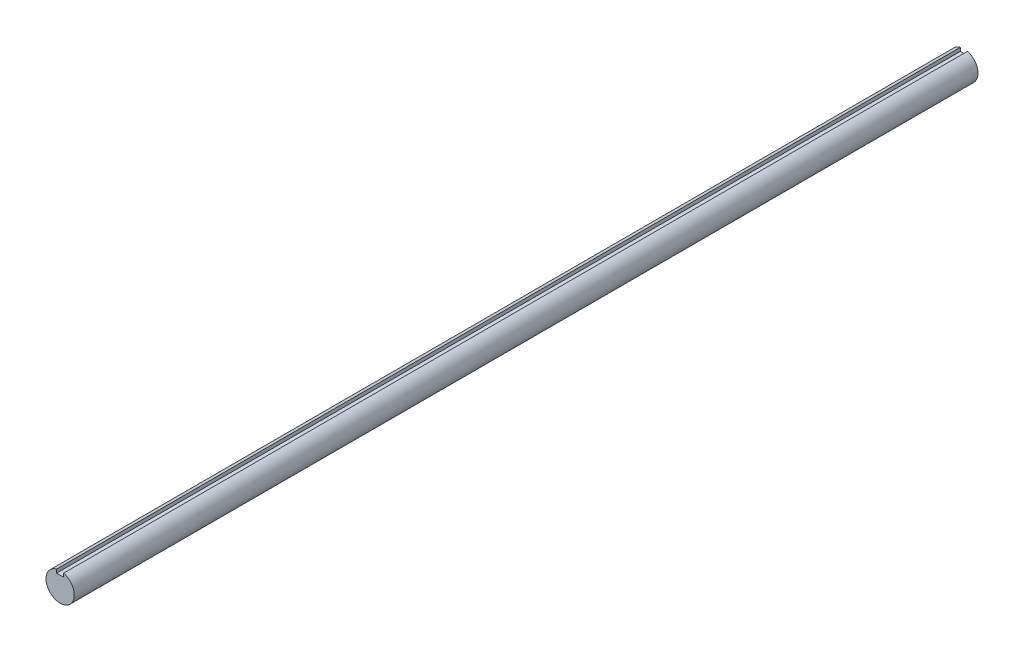
ISO-10303-21;
HEADER;
FILE_DESCRIPTION(('STEP AP214'),'2;1');
FILE_NAME('part.step','',(''),(''),'','','');
FILE_SCHEMA(('AUTOMOTIVE_DESIGN { 1 0 10303 214 1 1 1 1 }'));
ENDSEC;
DATA;
#1=APPLICATION_CONTEXT('core data for automotive mechanical design processes');
#2=APPLICATION_PROTOCOL_DEFINITION('international standard','automotive_design',2000,#1);
#3=PRODUCT_CONTEXT('',#1,'mechanical');
#4=PRODUCT('Part','Part','',(#3));
#5=PRODUCT_RELATED_PRODUCT_CATEGORY('part','',(#4));
#6=PRODUCT_DEFINITION_FORMATION('','',#4);
#7=PRODUCT_DEFINITION_CONTEXT('part definition',#1,'design');
#8=PRODUCT_DEFINITION('design','',#6,#7);
#9=PRODUCT_DEFINITION_SHAPE('','',#8);
#10=(LENGTH_UNIT() NAMED_UNIT(*) SI_UNIT(.MILLI.,.METRE.));
#11=(NAMED_UNIT(*) PLANE_ANGLE_UNIT() SI_UNIT($,.RADIAN.));
#12=(NAMED_UNIT(*) SI_UNIT($,.STERADIAN.) SOLID_ANGLE_UNIT());
#13=UNCERTAINTY_MEASURE_WITH_UNIT(LENGTH_MEASURE(1.E-05),#10,'distance_accuracy_value','');
#14=(GEOMETRIC_REPRESENTATION_CONTEXT(3) GLOBAL_UNCERTAINTY_ASSIGNED_CONTEXT((#13)) GLOBAL_UNIT_ASSIGNED_CONTEXT((#10,
#11,#12)) REPRESENTATION_CONTEXT('',''));
#15=CARTESIAN_POINT('',(0.,0.,0.));
#16=DIRECTION('',(0.,0.,1.));
#17=DIRECTION('',(1.,0.,0.));
#18=AXIS2_PLACEMENT_3D('',#15,#16,#17);
#19=CARTESIAN_POINT('',(0.,0.,304.8));
#20=DIRECTION('',(0.,0.,-1.));
#21=DIRECTION('',(-1.,0.,0.));
#22=AXIS2_PLACEMENT_3D('',#19,#20,#21);
#23=CYLINDRICAL_SURFACE('',#22,9.525);
#24=DIRECTION('',(0.,0.,-1.));
#25=VECTOR('',#24,1.);
#26=CARTESIAN_POINT('',(-2.3876,9.22089969796874,304.8));
#27=LINE('',#26,#25);
#28=CARTESIAN_POINT('',(-2.3876,9.22089969796874,304.8));
#29=VERTEX_POINT('',#28);
#30=CARTESIAN_POINT('',(-2.3876,9.22089969796874,-304.8));
#31=VERTEX_POINT('',#30);
#32=EDGE_CURVE('E91',#29,#31,#27,.T.);
#33=ORIENTED_EDGE('',*,*,#32,.T.);
#34=CARTESIAN_POINT('',(0.,0.,-304.8));
#35=DIRECTION('',(0.,0.,1.));
#36=DIRECTION('',(1.,0.,0.));
#37=AXIS2_PLACEMENT_3D('',#34,#35,#36);
#38=CIRCLE('',#37,9.525);
#39=CARTESIAN_POINT('',(2.3876,9.22089969796874,-304.8));
#40=VERTEX_POINT('',#39);
#41=EDGE_CURVE('E86',#31,#40,#38,.T.);
#42=ORIENTED_EDGE('',*,*,#41,.T.);
#43=DIRECTION('',(0.,0.,-1.));
#44=VECTOR('',#43,1.);
#45=CARTESIAN_POINT('',(2.3876,9.22089969796874,304.8));
#46=LINE('',#45,#44);
#47=CARTESIAN_POINT('',(2.3876,9.22089969796874,304.8));
#48=VERTEX_POINT('',#47);
#49=EDGE_CURVE('E11',#48,#40,#46,.T.);
#50=ORIENTED_EDGE('',*,*,#49,.F.);
#51=CARTESIAN_POINT('',(0.,0.,304.8));
#52=DIRECTION('',(0.,0.,1.));
#53=DIRECTION('',(1.,0.,0.));
#54=AXIS2_PLACEMENT_3D('',#51,#52,#53);
#55=CIRCLE('',#54,9.525);
#56=EDGE_CURVE('E97',#29,#48,#55,.T.);
#57=ORIENTED_EDGE('',*,*,#56,.F.);
#58=EDGE_LOOP('',(#33,#42,#50,#57));
#59=FACE_BOUND('',#58,.T.);
#60=ADVANCED_FACE('F34',(#59),#23,.T.);
#61=CARTESIAN_POINT('',(2.3876,6.83329969796874,304.8));
#62=DIRECTION('',(1.,0.,0.));
#63=DIRECTION('',(0.,0.,-1.));
#64=AXIS2_PLACEMENT_3D('',#61,#62,#63);
#65=PLANE('',#64);
#66=ORIENTED_EDGE('',*,*,#49,.T.);
#67=DIRECTION('',(0.,-1.,0.));
#68=VECTOR('',#67,1.);
#69=CARTESIAN_POINT('',(2.3876,6.83329969796874,-304.8));
#70=LINE('',#69,#68);
#71=CARTESIAN_POINT('',(2.3876,6.83329969796874,-304.8));
#72=VERTEX_POINT('',#71);
#73=EDGE_CURVE('E76',#40,#72,#70,.T.);
#74=ORIENTED_EDGE('',*,*,#73,.T.);
#75=DIRECTION('',(0.,0.,-1.));
#76=VECTOR('',#75,1.);
#77=CARTESIAN_POINT('',(2.3876,6.83329969796874,304.8));
#78=LINE('',#77,#76);
#79=CARTESIAN_POINT('',(2.3876,6.83329969796874,304.8));
#80=VERTEX_POINT('',#79);
#81=EDGE_CURVE('E41',#80,#72,#78,.T.);
#82=ORIENTED_EDGE('',*,*,#81,.F.);
#83=DIRECTION('',(0.,-1.,0.));
#84=VECTOR('',#83,1.);
#85=CARTESIAN_POINT('',(2.3876,6.83329969796874,304.8));
#86=LINE('',#85,#84);
#87=EDGE_CURVE('E77',#48,#80,#86,.T.);
#88=ORIENTED_EDGE('',*,*,#87,.F.);
#89=EDGE_LOOP('',(#66,#74,#82,#88));
#90=FACE_BOUND('',#89,.T.);
#91=ADVANCED_FACE('F74',(#90),#65,.F.);
#92=CARTESIAN_POINT('',(2.3876,6.83329969796874,304.8));
#93=DIRECTION('',(0.,-1.,0.));
#94=DIRECTION('',(0.,0.,-1.));
#95=AXIS2_PLACEMENT_3D('',#92,#93,#94);
#96=PLANE('',#95);
#97=ORIENTED_EDGE('',*,*,#81,.T.);
#98=DIRECTION('',(-1.,0.,0.));
#99=VECTOR('',#98,1.);
#100=CARTESIAN_POINT('',(2.3876,6.83329969796874,-304.8));
#101=LINE('',#100,#99);
#102=CARTESIAN_POINT('',(-2.3876,6.83329969796874,-304.8));
#103=VERTEX_POINT('',#102);
#104=EDGE_CURVE('E89',#72,#103,#101,.T.);
#105=ORIENTED_EDGE('',*,*,#104,.T.);
#106=DIRECTION('',(0.,0.,-1.));
#107=VECTOR('',#106,1.);
#108=CARTESIAN_POINT('',(-2.3876,6.83329969796874,304.8));
#109=LINE('',#108,#107);
#110=CARTESIAN_POINT('',(-2.3876,6.83329969796874,304.8));
#111=VERTEX_POINT('',#110);
#112=EDGE_CURVE('E103',#111,#103,#109,.T.);
#113=ORIENTED_EDGE('',*,*,#112,.F.);
#114=DIRECTION('',(-1.,0.,0.));
#115=VECTOR('',#114,1.);
#116=CARTESIAN_POINT('',(2.3876,6.83329969796874,304.8));
#117=LINE('',#116,#115);
#118=EDGE_CURVE('E53',#80,#111,#117,.T.);
#119=ORIENTED_EDGE('',*,*,#118,.F.);
#120=EDGE_LOOP('',(#97,#105,#113,#119));
#121=FACE_BOUND('',#120,.T.);
#122=ADVANCED_FACE('F105',(#121),#96,.F.);
#123=CARTESIAN_POINT('',(-2.3876,6.83329969796874,304.8));
#124=DIRECTION('',(-1.,0.,0.));
#125=DIRECTION('',(0.,0.,1.));
#126=AXIS2_PLACEMENT_3D('',#123,#124,#125);
#127=PLANE('',#126);
#128=ORIENTED_EDGE('',*,*,#112,.T.);
#129=DIRECTION('',(0.,1.,0.));
#130=VECTOR('',#129,1.);
#131=CARTESIAN_POINT('',(-2.3876,6.83329969796874,-304.8));
#132=LINE('',#131,#130);
#133=EDGE_CURVE('E95',#103,#31,#132,.T.);
#134=ORIENTED_EDGE('',*,*,#133,.T.);
#135=ORIENTED_EDGE('',*,*,#32,.F.);
#136=DIRECTION('',(0.,1.,0.));
#137=VECTOR('',#136,1.);
#138=CARTESIAN_POINT('',(-2.3876,6.83329969796874,304.8));
#139=LINE('',#138,#137);
#140=EDGE_CURVE('E48',#111,#29,#139,.T.);
#141=ORIENTED_EDGE('',*,*,#140,.F.);
#142=EDGE_LOOP('',(#128,#134,#135,#141));
#143=FACE_BOUND('',#142,.T.);
#144=ADVANCED_FACE('F107',(#143),#127,.F.);
#145=CARTESIAN_POINT('',(0.,0.,304.8));
#146=DIRECTION('',(0.,0.,1.));
#147=DIRECTION('',(1.,0.,0.));
#148=AXIS2_PLACEMENT_3D('',#145,#146,#147);
#149=PLANE('',#148);
#150=ORIENTED_EDGE('',*,*,#56,.T.);
#151=ORIENTED_EDGE('',*,*,#87,.T.);
#152=ORIENTED_EDGE('',*,*,#118,.T.);
#153=ORIENTED_EDGE('',*,*,#140,.T.);
#154=EDGE_LOOP('',(#150,#151,#152,#153));
#155=FACE_BOUND('',#154,.T.);
#156=ADVANCED_FACE('F108',(#155),#149,.T.);
#157=CARTESIAN_POINT('',(0.,0.,-304.8));
#158=DIRECTION('',(0.,0.,1.));
#159=DIRECTION('',(1.,0.,0.));
#160=AXIS2_PLACEMENT_3D('',#157,#158,#159);
#161=PLANE('',#160);
#162=ORIENTED_EDGE('',*,*,#41,.F.);
#163=ORIENTED_EDGE('',*,*,#133,.F.);
#164=ORIENTED_EDGE('',*,*,#104,.F.);
#165=ORIENTED_EDGE('',*,*,#73,.F.);
#166=EDGE_LOOP('',(#162,#163,#164,#165));
#167=FACE_BOUND('',#166,.T.);
#168=ADVANCED_FACE('F84',(#167),#161,.F.);
#169=CLOSED_SHELL('',(#60,#91,#122,#144,#156,#168));
#170=MANIFOLD_SOLID_BREP('B2',#169);
#171=ADVANCED_BREP_SHAPE_REPRESENTATION('',(#18,#170),#14);
#172=SHAPE_DEFINITION_REPRESENTATION(#9,#171);
ENDSEC;
END-ISO-10303-21;
